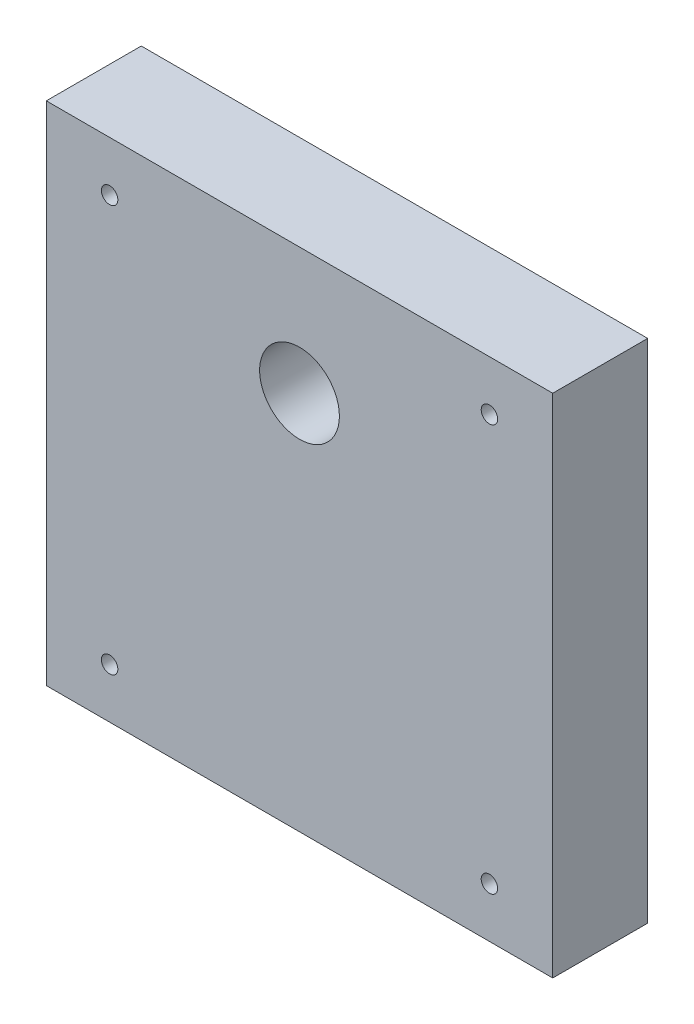
ISO-10303-21;
HEADER;
FILE_DESCRIPTION(('STEP AP214'),'2;1');
FILE_NAME('part.step','',(''),(''),'','','');
FILE_SCHEMA(('AUTOMOTIVE_DESIGN { 1 0 10303 214 1 1 1 1 }'));
ENDSEC;
DATA;
#1=APPLICATION_CONTEXT('core data for automotive mechanical design processes');
#2=APPLICATION_PROTOCOL_DEFINITION('international standard','automotive_design',2000,#1);
#3=PRODUCT_CONTEXT('',#1,'mechanical');
#4=PRODUCT('Part','Part','',(#3));
#5=PRODUCT_RELATED_PRODUCT_CATEGORY('part','',(#4));
#6=PRODUCT_DEFINITION_FORMATION('','',#4);
#7=PRODUCT_DEFINITION_CONTEXT('part definition',#1,'design');
#8=PRODUCT_DEFINITION('design','',#6,#7);
#9=PRODUCT_DEFINITION_SHAPE('','',#8);
#10=(LENGTH_UNIT() NAMED_UNIT(*) SI_UNIT(.MILLI.,.METRE.));
#11=(NAMED_UNIT(*) PLANE_ANGLE_UNIT() SI_UNIT($,.RADIAN.));
#12=(NAMED_UNIT(*) SI_UNIT($,.STERADIAN.) SOLID_ANGLE_UNIT());
#13=UNCERTAINTY_MEASURE_WITH_UNIT(LENGTH_MEASURE(1.E-05),#10,'distance_accuracy_value','');
#14=(GEOMETRIC_REPRESENTATION_CONTEXT(3) GLOBAL_UNCERTAINTY_ASSIGNED_CONTEXT((#13)) GLOBAL_UNIT_ASSIGNED_CONTEXT((#10,
#11,#12)) REPRESENTATION_CONTEXT('',''));
#15=CARTESIAN_POINT('',(0.,0.,0.));
#16=DIRECTION('',(0.,0.,1.));
#17=DIRECTION('',(1.,0.,0.));
#18=AXIS2_PLACEMENT_3D('',#15,#16,#17);
#19=CARTESIAN_POINT('',(-50.8,50.8,19.05));
#20=DIRECTION('',(1.,0.,0.));
#21=DIRECTION('',(0.,1.,0.));
#22=AXIS2_PLACEMENT_3D('',#19,#20,#21);
#23=PLANE('',#22);
#24=DIRECTION('',(0.,-1.,0.));
#25=VECTOR('',#24,1.);
#26=CARTESIAN_POINT('',(-50.8,50.8,0.));
#27=LINE('',#26,#25);
#28=CARTESIAN_POINT('',(-50.8,50.8,0.));
#29=VERTEX_POINT('',#28);
#30=CARTESIAN_POINT('',(-50.8,-50.8,0.));
#31=VERTEX_POINT('',#30);
#32=EDGE_CURVE('E113',#29,#31,#27,.T.);
#33=ORIENTED_EDGE('',*,*,#32,.T.);
#34=DIRECTION('',(0.,0.,-1.));
#35=VECTOR('',#34,1.);
#36=CARTESIAN_POINT('',(-50.8,-50.8,19.05));
#37=LINE('',#36,#35);
#38=CARTESIAN_POINT('',(-50.8,-50.8,19.05));
#39=VERTEX_POINT('',#38);
#40=EDGE_CURVE('E11',#39,#31,#37,.T.);
#41=ORIENTED_EDGE('',*,*,#40,.F.);
#42=DIRECTION('',(0.,-1.,0.));
#43=VECTOR('',#42,1.);
#44=CARTESIAN_POINT('',(-50.8,50.8,19.05));
#45=LINE('',#44,#43);
#46=CARTESIAN_POINT('',(-50.8,50.8,19.05));
#47=VERTEX_POINT('',#46);
#48=EDGE_CURVE('E95',#47,#39,#45,.T.);
#49=ORIENTED_EDGE('',*,*,#48,.F.);
#50=DIRECTION('',(0.,0.,-1.));
#51=VECTOR('',#50,1.);
#52=CARTESIAN_POINT('',(-50.8,50.8,19.05));
#53=LINE('',#52,#51);
#54=EDGE_CURVE('E62',#47,#29,#53,.T.);
#55=ORIENTED_EDGE('',*,*,#54,.T.);
#56=EDGE_LOOP('',(#33,#41,#49,#55));
#57=FACE_BOUND('',#56,.T.);
#58=ADVANCED_FACE('F45',(#57),#23,.F.);
#59=CARTESIAN_POINT('',(-50.8,-50.8,19.05));
#60=DIRECTION('',(0.,1.,0.));
#61=DIRECTION('',(0.,0.,1.));
#62=AXIS2_PLACEMENT_3D('',#59,#60,#61);
#63=PLANE('',#62);
#64=DIRECTION('',(1.,0.,0.));
#65=VECTOR('',#64,1.);
#66=CARTESIAN_POINT('',(-50.8,-50.8,0.));
#67=LINE('',#66,#65);
#68=CARTESIAN_POINT('',(50.8,-50.8,0.));
#69=VERTEX_POINT('',#68);
#70=EDGE_CURVE('E101',#31,#69,#67,.T.);
#71=ORIENTED_EDGE('',*,*,#70,.T.);
#72=DIRECTION('',(0.,0.,-1.));
#73=VECTOR('',#72,1.);
#74=CARTESIAN_POINT('',(50.8,-50.8,19.05));
#75=LINE('',#74,#73);
#76=CARTESIAN_POINT('',(50.8,-50.8,19.05));
#77=VERTEX_POINT('',#76);
#78=EDGE_CURVE('E54',#77,#69,#75,.T.);
#79=ORIENTED_EDGE('',*,*,#78,.F.);
#80=DIRECTION('',(1.,0.,0.));
#81=VECTOR('',#80,1.);
#82=CARTESIAN_POINT('',(-50.8,-50.8,19.05));
#83=LINE('',#82,#81);
#84=EDGE_CURVE('E87',#39,#77,#83,.T.);
#85=ORIENTED_EDGE('',*,*,#84,.F.);
#86=ORIENTED_EDGE('',*,*,#40,.T.);
#87=EDGE_LOOP('',(#71,#79,#85,#86));
#88=FACE_BOUND('',#87,.T.);
#89=ADVANCED_FACE('F100',(#88),#63,.F.);
#90=CARTESIAN_POINT('',(50.8,50.8,19.05));
#91=DIRECTION('',(1.,0.,0.));
#92=DIRECTION('',(0.,1.,0.));
#93=AXIS2_PLACEMENT_3D('',#90,#91,#92);
#94=PLANE('',#93);
#95=DIRECTION('',(0.,-1.,0.));
#96=VECTOR('',#95,1.);
#97=CARTESIAN_POINT('',(50.8,50.8,0.));
#98=LINE('',#97,#96);
#99=CARTESIAN_POINT('',(50.8,50.8,0.));
#100=VERTEX_POINT('',#99);
#101=EDGE_CURVE('E119',#100,#69,#98,.T.);
#102=ORIENTED_EDGE('',*,*,#101,.F.);
#103=DIRECTION('',(0.,0.,-1.));
#104=VECTOR('',#103,1.);
#105=CARTESIAN_POINT('',(50.8,50.8,19.05));
#106=LINE('',#105,#104);
#107=CARTESIAN_POINT('',(50.8,50.8,19.05));
#108=VERTEX_POINT('',#107);
#109=EDGE_CURVE('E76',#108,#100,#106,.T.);
#110=ORIENTED_EDGE('',*,*,#109,.F.);
#111=DIRECTION('',(0.,-1.,0.));
#112=VECTOR('',#111,1.);
#113=CARTESIAN_POINT('',(50.8,50.8,19.05));
#114=LINE('',#113,#112);
#115=EDGE_CURVE('E94',#108,#77,#114,.T.);
#116=ORIENTED_EDGE('',*,*,#115,.T.);
#117=ORIENTED_EDGE('',*,*,#78,.T.);
#118=EDGE_LOOP('',(#102,#110,#116,#117));
#119=FACE_BOUND('',#118,.T.);
#120=ADVANCED_FACE('F105',(#119),#94,.T.);
#121=CARTESIAN_POINT('',(-50.8,50.8,19.05));
#122=DIRECTION('',(0.,1.,0.));
#123=DIRECTION('',(0.,0.,1.));
#124=AXIS2_PLACEMENT_3D('',#121,#122,#123);
#125=PLANE('',#124);
#126=DIRECTION('',(1.,0.,0.));
#127=VECTOR('',#126,1.);
#128=CARTESIAN_POINT('',(-50.8,50.8,0.));
#129=LINE('',#128,#127);
#130=EDGE_CURVE('E122',#29,#100,#129,.T.);
#131=ORIENTED_EDGE('',*,*,#130,.F.);
#132=ORIENTED_EDGE('',*,*,#54,.F.);
#133=DIRECTION('',(1.,0.,0.));
#134=VECTOR('',#133,1.);
#135=CARTESIAN_POINT('',(-50.8,50.8,19.05));
#136=LINE('',#135,#134);
#137=EDGE_CURVE('E107',#47,#108,#136,.T.);
#138=ORIENTED_EDGE('',*,*,#137,.T.);
#139=ORIENTED_EDGE('',*,*,#109,.T.);
#140=EDGE_LOOP('',(#131,#132,#138,#139));
#141=FACE_BOUND('',#140,.T.);
#142=ADVANCED_FACE('F184',(#141),#125,.T.);
#143=CARTESIAN_POINT('',(0.,0.,19.05));
#144=DIRECTION('',(0.,0.,1.));
#145=DIRECTION('',(1.,0.,0.));
#146=AXIS2_PLACEMENT_3D('',#143,#144,#145);
#147=PLANE('',#146);
#148=CARTESIAN_POINT('',(-38.1,40.767,19.05));
#149=DIRECTION('',(0.,0.,1.));
#150=DIRECTION('',(1.,0.,0.));
#151=AXIS2_PLACEMENT_3D('',#148,#149,#150);
#152=CIRCLE('',#151,1.651);
#153=CARTESIAN_POINT('',(-36.449,40.767,19.05));
#154=VERTEX_POINT('',#153);
#155=EDGE_CURVE('E164',#154,#154,#152,.T.);
#156=ORIENTED_EDGE('',*,*,#155,.F.);
#157=EDGE_LOOP('',(#156));
#158=FACE_BOUND('',#157,.T.);
#159=CARTESIAN_POINT('',(38.1,-40.767,19.05));
#160=DIRECTION('',(0.,0.,1.));
#161=DIRECTION('',(1.,0.,0.));
#162=AXIS2_PLACEMENT_3D('',#159,#160,#161);
#163=CIRCLE('',#162,1.651);
#164=CARTESIAN_POINT('',(39.751,-40.767,19.05));
#165=VERTEX_POINT('',#164);
#166=EDGE_CURVE('E160',#165,#165,#163,.T.);
#167=ORIENTED_EDGE('',*,*,#166,.F.);
#168=EDGE_LOOP('',(#167));
#169=FACE_BOUND('',#168,.T.);
#170=CARTESIAN_POINT('',(38.1,40.767,19.05));
#171=DIRECTION('',(0.,0.,1.));
#172=DIRECTION('',(1.,0.,0.));
#173=AXIS2_PLACEMENT_3D('',#170,#171,#172);
#174=CIRCLE('',#173,1.651);
#175=CARTESIAN_POINT('',(39.751,40.767,19.05));
#176=VERTEX_POINT('',#175);
#177=EDGE_CURVE('E152',#176,#176,#174,.T.);
#178=ORIENTED_EDGE('',*,*,#177,.F.);
#179=EDGE_LOOP('',(#178));
#180=FACE_BOUND('',#179,.T.);
#181=CARTESIAN_POINT('',(-38.1,-40.767,19.05));
#182=DIRECTION('',(0.,0.,1.));
#183=DIRECTION('',(1.,0.,0.));
#184=AXIS2_PLACEMENT_3D('',#181,#182,#183);
#185=CIRCLE('',#184,1.651);
#186=CARTESIAN_POINT('',(-36.449,-40.767,19.05));
#187=VERTEX_POINT('',#186);
#188=EDGE_CURVE('E140',#187,#187,#185,.T.);
#189=ORIENTED_EDGE('',*,*,#188,.F.);
#190=EDGE_LOOP('',(#189));
#191=FACE_BOUND('',#190,.T.);
#192=CARTESIAN_POINT('',(0.,25.4,19.05));
#193=DIRECTION('',(0.,0.,1.));
#194=DIRECTION('',(1.,0.,0.));
#195=AXIS2_PLACEMENT_3D('',#192,#193,#194);
#196=CIRCLE('',#195,8.001);
#197=CARTESIAN_POINT('',(8.00099999999999,25.4,19.05));
#198=VERTEX_POINT('',#197);
#199=EDGE_CURVE('E132',#198,#198,#196,.T.);
#200=ORIENTED_EDGE('',*,*,#199,.F.);
#201=EDGE_LOOP('',(#200));
#202=FACE_BOUND('',#201,.T.);
#203=ORIENTED_EDGE('',*,*,#48,.T.);
#204=ORIENTED_EDGE('',*,*,#84,.T.);
#205=ORIENTED_EDGE('',*,*,#115,.F.);
#206=ORIENTED_EDGE('',*,*,#137,.F.);
#207=EDGE_LOOP('',(#203,#204,#205,#206));
#208=FACE_BOUND('',#207,.T.);
#209=ADVANCED_FACE('F91',(#158,#169,#180,#191,#202,#208),#147,.T.);
#210=CARTESIAN_POINT('',(0.,0.,0.));
#211=DIRECTION('',(0.,0.,1.));
#212=DIRECTION('',(1.,0.,0.));
#213=AXIS2_PLACEMENT_3D('',#210,#211,#212);
#214=PLANE('',#213);
#215=CARTESIAN_POINT('',(-38.1,40.767,0.));
#216=DIRECTION('',(0.,0.,1.));
#217=DIRECTION('',(1.,0.,0.));
#218=AXIS2_PLACEMENT_3D('',#215,#216,#217);
#219=CIRCLE('',#218,1.651);
#220=CARTESIAN_POINT('',(-36.449,40.767,0.));
#221=VERTEX_POINT('',#220);
#222=EDGE_CURVE('E144',#221,#221,#219,.T.);
#223=ORIENTED_EDGE('',*,*,#222,.T.);
#224=EDGE_LOOP('',(#223));
#225=FACE_BOUND('',#224,.T.);
#226=CARTESIAN_POINT('',(38.1,-40.767,0.));
#227=DIRECTION('',(0.,0.,1.));
#228=DIRECTION('',(1.,0.,0.));
#229=AXIS2_PLACEMENT_3D('',#226,#227,#228);
#230=CIRCLE('',#229,1.651);
#231=CARTESIAN_POINT('',(39.751,-40.767,0.));
#232=VERTEX_POINT('',#231);
#233=EDGE_CURVE('E156',#232,#232,#230,.T.);
#234=ORIENTED_EDGE('',*,*,#233,.T.);
#235=EDGE_LOOP('',(#234));
#236=FACE_BOUND('',#235,.T.);
#237=CARTESIAN_POINT('',(38.1,40.767,0.));
#238=DIRECTION('',(0.,0.,1.));
#239=DIRECTION('',(1.,0.,0.));
#240=AXIS2_PLACEMENT_3D('',#237,#238,#239);
#241=CIRCLE('',#240,1.651);
#242=CARTESIAN_POINT('',(39.751,40.767,0.));
#243=VERTEX_POINT('',#242);
#244=EDGE_CURVE('E148',#243,#243,#241,.T.);
#245=ORIENTED_EDGE('',*,*,#244,.T.);
#246=EDGE_LOOP('',(#245));
#247=FACE_BOUND('',#246,.T.);
#248=CARTESIAN_POINT('',(-38.1,-40.767,0.));
#249=DIRECTION('',(0.,0.,1.));
#250=DIRECTION('',(1.,0.,0.));
#251=AXIS2_PLACEMENT_3D('',#248,#249,#250);
#252=CIRCLE('',#251,1.651);
#253=CARTESIAN_POINT('',(-36.449,-40.767,0.));
#254=VERTEX_POINT('',#253);
#255=EDGE_CURVE('E136',#254,#254,#252,.T.);
#256=ORIENTED_EDGE('',*,*,#255,.T.);
#257=EDGE_LOOP('',(#256));
#258=FACE_BOUND('',#257,.T.);
#259=CARTESIAN_POINT('',(0.,25.4,0.));
#260=DIRECTION('',(0.,0.,1.));
#261=DIRECTION('',(1.,0.,0.));
#262=AXIS2_PLACEMENT_3D('',#259,#260,#261);
#263=CIRCLE('',#262,8.001);
#264=CARTESIAN_POINT('',(8.00099999999999,25.4,0.));
#265=VERTEX_POINT('',#264);
#266=EDGE_CURVE('E116',#265,#265,#263,.T.);
#267=ORIENTED_EDGE('',*,*,#266,.T.);
#268=EDGE_LOOP('',(#267));
#269=FACE_BOUND('',#268,.T.);
#270=ORIENTED_EDGE('',*,*,#32,.F.);
#271=ORIENTED_EDGE('',*,*,#130,.T.);
#272=ORIENTED_EDGE('',*,*,#101,.T.);
#273=ORIENTED_EDGE('',*,*,#70,.F.);
#274=EDGE_LOOP('',(#270,#271,#272,#273));
#275=FACE_BOUND('',#274,.T.);
#276=ADVANCED_FACE('F172',(#225,#236,#247,#258,#269,#275),#214,.F.);
#277=CARTESIAN_POINT('',(0.,25.4,0.));
#278=DIRECTION('',(0.,0.,1.));
#279=DIRECTION('',(1.,0.,0.));
#280=AXIS2_PLACEMENT_3D('',#277,#278,#279);
#281=CYLINDRICAL_SURFACE('',#280,8.001);
#282=CARTESIAN_POINT('',(8.00099999999999,25.4,0.));
#283=CARTESIAN_POINT('',(8.00099999999999,25.4,0.1984375));
#284=CARTESIAN_POINT('',(8.00099999999999,25.4,0.396875));
#285=CARTESIAN_POINT('',(8.00099999999999,25.4,0.79375));
#286=CARTESIAN_POINT('',(8.00099999999999,25.4,0.9921875));
#287=CARTESIAN_POINT('',(8.00099999999999,25.4,1.3890625));
#288=CARTESIAN_POINT('',(8.00099999999999,25.4,1.5875));
#289=CARTESIAN_POINT('',(8.00099999999999,25.4,1.984375));
#290=CARTESIAN_POINT('',(8.00099999999999,25.4,2.1828125));
#291=CARTESIAN_POINT('',(8.00099999999999,25.4,2.5796875));
#292=CARTESIAN_POINT('',(8.00099999999999,25.4,2.778125));
#293=CARTESIAN_POINT('',(8.00099999999999,25.4,3.175));
#294=CARTESIAN_POINT('',(8.00099999999999,25.4,3.3734375));
#295=CARTESIAN_POINT('',(8.00099999999999,25.4,3.7703125));
#296=CARTESIAN_POINT('',(8.00099999999999,25.4,3.96875));
#297=CARTESIAN_POINT('',(8.00099999999999,25.4,4.365625));
#298=CARTESIAN_POINT('',(8.00099999999999,25.4,4.5640625));
#299=CARTESIAN_POINT('',(8.00099999999999,25.4,4.9609375));
#300=CARTESIAN_POINT('',(8.00099999999999,25.4,5.159375));
#301=CARTESIAN_POINT('',(8.00099999999999,25.4,5.55625));
#302=CARTESIAN_POINT('',(8.00099999999999,25.4,5.7546875));
#303=CARTESIAN_POINT('',(8.00099999999999,25.4,6.1515625));
#304=CARTESIAN_POINT('',(8.00099999999999,25.4,6.35));
#305=CARTESIAN_POINT('',(8.00099999999999,25.4,6.746875));
#306=CARTESIAN_POINT('',(8.00099999999999,25.4,6.9453125));
#307=CARTESIAN_POINT('',(8.00099999999999,25.4,7.3421875));
#308=CARTESIAN_POINT('',(8.00099999999999,25.4,7.540625));
#309=CARTESIAN_POINT('',(8.00099999999999,25.4,7.9375));
#310=CARTESIAN_POINT('',(8.00099999999999,25.4,8.1359375));
#311=CARTESIAN_POINT('',(8.00099999999999,25.4,8.5328125));
#312=CARTESIAN_POINT('',(8.00099999999999,25.4,8.73125));
#313=CARTESIAN_POINT('',(8.00099999999999,25.4,9.128125));
#314=CARTESIAN_POINT('',(8.00099999999999,25.4,9.3265625));
#315=CARTESIAN_POINT('',(8.00099999999999,25.4,9.7234375));
#316=CARTESIAN_POINT('',(8.00099999999999,25.4,9.921875));
#317=CARTESIAN_POINT('',(8.00099999999999,25.4,10.31875));
#318=CARTESIAN_POINT('',(8.00099999999999,25.4,10.5171875));
#319=CARTESIAN_POINT('',(8.00099999999999,25.4,10.9140625));
#320=CARTESIAN_POINT('',(8.00099999999999,25.4,11.1125));
#321=CARTESIAN_POINT('',(8.00099999999999,25.4,11.509375));
#322=CARTESIAN_POINT('',(8.00099999999999,25.4,11.7078125));
#323=CARTESIAN_POINT('',(8.00099999999999,25.4,12.1046875));
#324=CARTESIAN_POINT('',(8.00099999999999,25.4,12.303125));
#325=CARTESIAN_POINT('',(8.00099999999999,25.4,12.7));
#326=CARTESIAN_POINT('',(8.00099999999999,25.4,12.8984375));
#327=CARTESIAN_POINT('',(8.00099999999999,25.4,13.2953125));
#328=CARTESIAN_POINT('',(8.00099999999999,25.4,13.49375));
#329=CARTESIAN_POINT('',(8.00099999999999,25.4,13.890625));
#330=CARTESIAN_POINT('',(8.00099999999999,25.4,14.0890625));
#331=CARTESIAN_POINT('',(8.00099999999999,25.4,14.4859375));
#332=CARTESIAN_POINT('',(8.00099999999999,25.4,14.684375));
#333=CARTESIAN_POINT('',(8.00099999999999,25.4,15.08125));
#334=CARTESIAN_POINT('',(8.00099999999999,25.4,15.2796875));
#335=CARTESIAN_POINT('',(8.00099999999999,25.4,15.6765625));
#336=CARTESIAN_POINT('',(8.00099999999999,25.4,15.875));
#337=CARTESIAN_POINT('',(8.00099999999999,25.4,16.271875));
#338=CARTESIAN_POINT('',(8.00099999999999,25.4,16.4703125));
#339=CARTESIAN_POINT('',(8.00099999999999,25.4,16.8671875));
#340=CARTESIAN_POINT('',(8.00099999999999,25.4,17.065625));
#341=CARTESIAN_POINT('',(8.00099999999999,25.4,17.4625));
#342=CARTESIAN_POINT('',(8.00099999999999,25.4,17.6609375));
#343=CARTESIAN_POINT('',(8.00099999999999,25.4,18.0578125));
#344=CARTESIAN_POINT('',(8.00099999999999,25.4,18.25625));
#345=CARTESIAN_POINT('',(8.00099999999999,25.4,18.653125));
#346=CARTESIAN_POINT('',(8.00099999999999,25.4,18.8515625));
#347=CARTESIAN_POINT('',(8.00099999999999,25.4,19.05));
#348=B_SPLINE_CURVE_WITH_KNOTS('',3,(#282,#283,#284,#285,#286,#287,#288,#289,#290,#291,#292,
#293,#294,#295,#296,#297,#298,#299,#300,#301,#302,#303,#304,#305,#306,#307,#308,#309,#310,#311,
#312,#313,#314,#315,#316,#317,#318,#319,#320,#321,#322,#323,#324,#325,#326,#327,#328,#329,#330,
#331,#332,#333,#334,#335,#336,#337,#338,#339,#340,#341,#342,#343,#344,#345,#346,#347),
.UNSPECIFIED.,.F.,.F.,(4,2,2,2,2,2,2,2,2,2,2,2,2,2,2,2,2,2,2,2,2,2,2,2,2,2,2,2,2,2,2,2,4),(0.,
0.5953125,1.190625,1.7859375,2.38125,2.9765625,3.571875,4.1671875,4.7625,5.3578125,5.953125,
6.5484375,7.14375,7.7390625,8.334375,8.9296875,9.525,10.1203125,10.715625,11.3109375,11.90625,
12.5015625,13.096875,13.6921875,14.2875,14.8828125,15.478125,16.0734375,16.66875,17.2640625,
17.859375,18.4546875,19.05),.UNSPECIFIED.);
#349=EDGE_CURVE('BSEAM194',#265,#198,#348,.T.);
#350=ORIENTED_EDGE('',*,*,#266,.F.);
#351=ORIENTED_EDGE('',*,*,#199,.T.);
#352=ORIENTED_EDGE('',*,*,#349,.T.);
#353=ORIENTED_EDGE('',*,*,#349,.F.);
#354=EDGE_LOOP('',(#350,#352,#351,#353));
#355=FACE_BOUND('',#354,.T.);
#356=ADVANCED_FACE('F194',(#355),#281,.F.);
#357=CARTESIAN_POINT('',(-38.1,-40.767,0.));
#358=DIRECTION('',(0.,0.,1.));
#359=DIRECTION('',(1.,0.,0.));
#360=AXIS2_PLACEMENT_3D('',#357,#358,#359);
#361=CYLINDRICAL_SURFACE('',#360,1.651);
#362=CARTESIAN_POINT('',(-36.449,-40.767,0.));
#363=CARTESIAN_POINT('',(-36.449,-40.767,0.1984375));
#364=CARTESIAN_POINT('',(-36.449,-40.767,0.396875));
#365=CARTESIAN_POINT('',(-36.449,-40.767,0.79375));
#366=CARTESIAN_POINT('',(-36.449,-40.767,0.9921875));
#367=CARTESIAN_POINT('',(-36.449,-40.767,1.3890625));
#368=CARTESIAN_POINT('',(-36.449,-40.767,1.5875));
#369=CARTESIAN_POINT('',(-36.449,-40.767,1.984375));
#370=CARTESIAN_POINT('',(-36.449,-40.767,2.1828125));
#371=CARTESIAN_POINT('',(-36.449,-40.767,2.5796875));
#372=CARTESIAN_POINT('',(-36.449,-40.767,2.778125));
#373=CARTESIAN_POINT('',(-36.449,-40.767,3.175));
#374=CARTESIAN_POINT('',(-36.449,-40.767,3.3734375));
#375=CARTESIAN_POINT('',(-36.449,-40.767,3.7703125));
#376=CARTESIAN_POINT('',(-36.449,-40.767,3.96875));
#377=CARTESIAN_POINT('',(-36.449,-40.767,4.365625));
#378=CARTESIAN_POINT('',(-36.449,-40.767,4.5640625));
#379=CARTESIAN_POINT('',(-36.449,-40.767,4.9609375));
#380=CARTESIAN_POINT('',(-36.449,-40.767,5.159375));
#381=CARTESIAN_POINT('',(-36.449,-40.767,5.55625));
#382=CARTESIAN_POINT('',(-36.449,-40.767,5.7546875));
#383=CARTESIAN_POINT('',(-36.449,-40.767,6.1515625));
#384=CARTESIAN_POINT('',(-36.449,-40.767,6.35));
#385=CARTESIAN_POINT('',(-36.449,-40.767,6.746875));
#386=CARTESIAN_POINT('',(-36.449,-40.767,6.9453125));
#387=CARTESIAN_POINT('',(-36.449,-40.767,7.3421875));
#388=CARTESIAN_POINT('',(-36.449,-40.767,7.540625));
#389=CARTESIAN_POINT('',(-36.449,-40.767,7.9375));
#390=CARTESIAN_POINT('',(-36.449,-40.767,8.1359375));
#391=CARTESIAN_POINT('',(-36.449,-40.767,8.5328125));
#392=CARTESIAN_POINT('',(-36.449,-40.767,8.73125));
#393=CARTESIAN_POINT('',(-36.449,-40.767,9.128125));
#394=CARTESIAN_POINT('',(-36.449,-40.767,9.3265625));
#395=CARTESIAN_POINT('',(-36.449,-40.767,9.7234375));
#396=CARTESIAN_POINT('',(-36.449,-40.767,9.921875));
#397=CARTESIAN_POINT('',(-36.449,-40.767,10.31875));
#398=CARTESIAN_POINT('',(-36.449,-40.767,10.5171875));
#399=CARTESIAN_POINT('',(-36.449,-40.767,10.9140625));
#400=CARTESIAN_POINT('',(-36.449,-40.767,11.1125));
#401=CARTESIAN_POINT('',(-36.449,-40.767,11.509375));
#402=CARTESIAN_POINT('',(-36.449,-40.767,11.7078125));
#403=CARTESIAN_POINT('',(-36.449,-40.767,12.1046875));
#404=CARTESIAN_POINT('',(-36.449,-40.767,12.303125));
#405=CARTESIAN_POINT('',(-36.449,-40.767,12.7));
#406=CARTESIAN_POINT('',(-36.449,-40.767,12.8984375));
#407=CARTESIAN_POINT('',(-36.449,-40.767,13.2953125));
#408=CARTESIAN_POINT('',(-36.449,-40.767,13.49375));
#409=CARTESIAN_POINT('',(-36.449,-40.767,13.890625));
#410=CARTESIAN_POINT('',(-36.449,-40.767,14.0890625));
#411=CARTESIAN_POINT('',(-36.449,-40.767,14.4859375));
#412=CARTESIAN_POINT('',(-36.449,-40.767,14.684375));
#413=CARTESIAN_POINT('',(-36.449,-40.767,15.08125));
#414=CARTESIAN_POINT('',(-36.449,-40.767,15.2796875));
#415=CARTESIAN_POINT('',(-36.449,-40.767,15.6765625));
#416=CARTESIAN_POINT('',(-36.449,-40.767,15.875));
#417=CARTESIAN_POINT('',(-36.449,-40.767,16.271875));
#418=CARTESIAN_POINT('',(-36.449,-40.767,16.4703125));
#419=CARTESIAN_POINT('',(-36.449,-40.767,16.8671875));
#420=CARTESIAN_POINT('',(-36.449,-40.767,17.065625));
#421=CARTESIAN_POINT('',(-36.449,-40.767,17.4625));
#422=CARTESIAN_POINT('',(-36.449,-40.767,17.6609375));
#423=CARTESIAN_POINT('',(-36.449,-40.767,18.0578125));
#424=CARTESIAN_POINT('',(-36.449,-40.767,18.25625));
#425=CARTESIAN_POINT('',(-36.449,-40.767,18.653125));
#426=CARTESIAN_POINT('',(-36.449,-40.767,18.8515625));
#427=CARTESIAN_POINT('',(-36.449,-40.767,19.05));
#428=B_SPLINE_CURVE_WITH_KNOTS('',3,(#362,#363,#364,#365,#366,#367,#368,#369,#370,#371,#372,
#373,#374,#375,#376,#377,#378,#379,#380,#381,#382,#383,#384,#385,#386,#387,#388,#389,#390,#391,
#392,#393,#394,#395,#396,#397,#398,#399,#400,#401,#402,#403,#404,#405,#406,#407,#408,#409,#410,
#411,#412,#413,#414,#415,#416,#417,#418,#419,#420,#421,#422,#423,#424,#425,#426,#427),
.UNSPECIFIED.,.F.,.F.,(4,2,2,2,2,2,2,2,2,2,2,2,2,2,2,2,2,2,2,2,2,2,2,2,2,2,2,2,2,2,2,2,4),(0.,
0.5953125,1.190625,1.7859375,2.38125,2.9765625,3.571875,4.1671875,4.7625,5.3578125,5.953125,
6.5484375,7.14375,7.7390625,8.334375,8.9296875,9.525,10.1203125,10.715625,11.3109375,11.90625,
12.5015625,13.096875,13.6921875,14.2875,14.8828125,15.478125,16.0734375,16.66875,17.2640625,
17.859375,18.4546875,19.05),.UNSPECIFIED.);
#429=EDGE_CURVE('BSEAM196',#254,#187,#428,.T.);
#430=ORIENTED_EDGE('',*,*,#255,.F.);
#431=ORIENTED_EDGE('',*,*,#188,.T.);
#432=ORIENTED_EDGE('',*,*,#429,.T.);
#433=ORIENTED_EDGE('',*,*,#429,.F.);
#434=EDGE_LOOP('',(#430,#432,#431,#433));
#435=FACE_BOUND('',#434,.T.);
#436=ADVANCED_FACE('F196',(#435),#361,.F.);
#437=CARTESIAN_POINT('',(38.1,40.767,0.));
#438=DIRECTION('',(0.,0.,1.));
#439=DIRECTION('',(1.,0.,0.));
#440=AXIS2_PLACEMENT_3D('',#437,#438,#439);
#441=CYLINDRICAL_SURFACE('',#440,1.651);
#442=CARTESIAN_POINT('',(39.751,40.767,0.));
#443=CARTESIAN_POINT('',(39.751,40.767,0.1984375));
#444=CARTESIAN_POINT('',(39.751,40.767,0.396875));
#445=CARTESIAN_POINT('',(39.751,40.767,0.79375));
#446=CARTESIAN_POINT('',(39.751,40.767,0.9921875));
#447=CARTESIAN_POINT('',(39.751,40.767,1.3890625));
#448=CARTESIAN_POINT('',(39.751,40.767,1.5875));
#449=CARTESIAN_POINT('',(39.751,40.767,1.984375));
#450=CARTESIAN_POINT('',(39.751,40.767,2.1828125));
#451=CARTESIAN_POINT('',(39.751,40.767,2.5796875));
#452=CARTESIAN_POINT('',(39.751,40.767,2.778125));
#453=CARTESIAN_POINT('',(39.751,40.767,3.175));
#454=CARTESIAN_POINT('',(39.751,40.767,3.3734375));
#455=CARTESIAN_POINT('',(39.751,40.767,3.7703125));
#456=CARTESIAN_POINT('',(39.751,40.767,3.96875));
#457=CARTESIAN_POINT('',(39.751,40.767,4.365625));
#458=CARTESIAN_POINT('',(39.751,40.767,4.5640625));
#459=CARTESIAN_POINT('',(39.751,40.767,4.9609375));
#460=CARTESIAN_POINT('',(39.751,40.767,5.159375));
#461=CARTESIAN_POINT('',(39.751,40.767,5.55625));
#462=CARTESIAN_POINT('',(39.751,40.767,5.7546875));
#463=CARTESIAN_POINT('',(39.751,40.767,6.1515625));
#464=CARTESIAN_POINT('',(39.751,40.767,6.35));
#465=CARTESIAN_POINT('',(39.751,40.767,6.746875));
#466=CARTESIAN_POINT('',(39.751,40.767,6.9453125));
#467=CARTESIAN_POINT('',(39.751,40.767,7.3421875));
#468=CARTESIAN_POINT('',(39.751,40.767,7.540625));
#469=CARTESIAN_POINT('',(39.751,40.767,7.9375));
#470=CARTESIAN_POINT('',(39.751,40.767,8.1359375));
#471=CARTESIAN_POINT('',(39.751,40.767,8.5328125));
#472=CARTESIAN_POINT('',(39.751,40.767,8.73125));
#473=CARTESIAN_POINT('',(39.751,40.767,9.128125));
#474=CARTESIAN_POINT('',(39.751,40.767,9.3265625));
#475=CARTESIAN_POINT('',(39.751,40.767,9.7234375));
#476=CARTESIAN_POINT('',(39.751,40.767,9.921875));
#477=CARTESIAN_POINT('',(39.751,40.767,10.31875));
#478=CARTESIAN_POINT('',(39.751,40.767,10.5171875));
#479=CARTESIAN_POINT('',(39.751,40.767,10.9140625));
#480=CARTESIAN_POINT('',(39.751,40.767,11.1125));
#481=CARTESIAN_POINT('',(39.751,40.767,11.509375));
#482=CARTESIAN_POINT('',(39.751,40.767,11.7078125));
#483=CARTESIAN_POINT('',(39.751,40.767,12.1046875));
#484=CARTESIAN_POINT('',(39.751,40.767,12.303125));
#485=CARTESIAN_POINT('',(39.751,40.767,12.7));
#486=CARTESIAN_POINT('',(39.751,40.767,12.8984375));
#487=CARTESIAN_POINT('',(39.751,40.767,13.2953125));
#488=CARTESIAN_POINT('',(39.751,40.767,13.49375));
#489=CARTESIAN_POINT('',(39.751,40.767,13.890625));
#490=CARTESIAN_POINT('',(39.751,40.767,14.0890625));
#491=CARTESIAN_POINT('',(39.751,40.767,14.4859375));
#492=CARTESIAN_POINT('',(39.751,40.767,14.684375));
#493=CARTESIAN_POINT('',(39.751,40.767,15.08125));
#494=CARTESIAN_POINT('',(39.751,40.767,15.2796875));
#495=CARTESIAN_POINT('',(39.751,40.767,15.6765625));
#496=CARTESIAN_POINT('',(39.751,40.767,15.875));
#497=CARTESIAN_POINT('',(39.751,40.767,16.271875));
#498=CARTESIAN_POINT('',(39.751,40.767,16.4703125));
#499=CARTESIAN_POINT('',(39.751,40.767,16.8671875));
#500=CARTESIAN_POINT('',(39.751,40.767,17.065625));
#501=CARTESIAN_POINT('',(39.751,40.767,17.4625));
#502=CARTESIAN_POINT('',(39.751,40.767,17.6609375));
#503=CARTESIAN_POINT('',(39.751,40.767,18.0578125));
#504=CARTESIAN_POINT('',(39.751,40.767,18.25625));
#505=CARTESIAN_POINT('',(39.751,40.767,18.653125));
#506=CARTESIAN_POINT('',(39.751,40.767,18.8515625));
#507=CARTESIAN_POINT('',(39.751,40.767,19.05));
#508=B_SPLINE_CURVE_WITH_KNOTS('',3,(#442,#443,#444,#445,#446,#447,#448,#449,#450,#451,#452,
#453,#454,#455,#456,#457,#458,#459,#460,#461,#462,#463,#464,#465,#466,#467,#468,#469,#470,#471,
#472,#473,#474,#475,#476,#477,#478,#479,#480,#481,#482,#483,#484,#485,#486,#487,#488,#489,#490,
#491,#492,#493,#494,#495,#496,#497,#498,#499,#500,#501,#502,#503,#504,#505,#506,#507),
.UNSPECIFIED.,.F.,.F.,(4,2,2,2,2,2,2,2,2,2,2,2,2,2,2,2,2,2,2,2,2,2,2,2,2,2,2,2,2,2,2,2,4),(0.,
0.5953125,1.190625,1.7859375,2.38125,2.9765625,3.571875,4.1671875,4.7625,5.3578125,5.953125,
6.5484375,7.14375,7.7390625,8.334375,8.9296875,9.525,10.1203125,10.715625,11.3109375,11.90625,
12.5015625,13.096875,13.6921875,14.2875,14.8828125,15.478125,16.0734375,16.66875,17.2640625,
17.859375,18.4546875,19.05),.UNSPECIFIED.);
#509=EDGE_CURVE('BSEAM203',#243,#176,#508,.T.);
#510=ORIENTED_EDGE('',*,*,#244,.F.);
#511=ORIENTED_EDGE('',*,*,#177,.T.);
#512=ORIENTED_EDGE('',*,*,#509,.T.);
#513=ORIENTED_EDGE('',*,*,#509,.F.);
#514=EDGE_LOOP('',(#510,#512,#511,#513));
#515=FACE_BOUND('',#514,.T.);
#516=ADVANCED_FACE('F203',(#515),#441,.F.);
#517=CARTESIAN_POINT('',(38.1,-40.767,0.));
#518=DIRECTION('',(0.,0.,1.));
#519=DIRECTION('',(1.,0.,0.));
#520=AXIS2_PLACEMENT_3D('',#517,#518,#519);
#521=CYLINDRICAL_SURFACE('',#520,1.651);
#522=CARTESIAN_POINT('',(39.751,-40.767,0.));
#523=CARTESIAN_POINT('',(39.751,-40.767,0.1984375));
#524=CARTESIAN_POINT('',(39.751,-40.767,0.396875));
#525=CARTESIAN_POINT('',(39.751,-40.767,0.79375));
#526=CARTESIAN_POINT('',(39.751,-40.767,0.9921875));
#527=CARTESIAN_POINT('',(39.751,-40.767,1.3890625));
#528=CARTESIAN_POINT('',(39.751,-40.767,1.5875));
#529=CARTESIAN_POINT('',(39.751,-40.767,1.984375));
#530=CARTESIAN_POINT('',(39.751,-40.767,2.1828125));
#531=CARTESIAN_POINT('',(39.751,-40.767,2.5796875));
#532=CARTESIAN_POINT('',(39.751,-40.767,2.778125));
#533=CARTESIAN_POINT('',(39.751,-40.767,3.175));
#534=CARTESIAN_POINT('',(39.751,-40.767,3.3734375));
#535=CARTESIAN_POINT('',(39.751,-40.767,3.7703125));
#536=CARTESIAN_POINT('',(39.751,-40.767,3.96875));
#537=CARTESIAN_POINT('',(39.751,-40.767,4.365625));
#538=CARTESIAN_POINT('',(39.751,-40.767,4.5640625));
#539=CARTESIAN_POINT('',(39.751,-40.767,4.9609375));
#540=CARTESIAN_POINT('',(39.751,-40.767,5.159375));
#541=CARTESIAN_POINT('',(39.751,-40.767,5.55625));
#542=CARTESIAN_POINT('',(39.751,-40.767,5.7546875));
#543=CARTESIAN_POINT('',(39.751,-40.767,6.1515625));
#544=CARTESIAN_POINT('',(39.751,-40.767,6.35));
#545=CARTESIAN_POINT('',(39.751,-40.767,6.746875));
#546=CARTESIAN_POINT('',(39.751,-40.767,6.9453125));
#547=CARTESIAN_POINT('',(39.751,-40.767,7.3421875));
#548=CARTESIAN_POINT('',(39.751,-40.767,7.540625));
#549=CARTESIAN_POINT('',(39.751,-40.767,7.9375));
#550=CARTESIAN_POINT('',(39.751,-40.767,8.1359375));
#551=CARTESIAN_POINT('',(39.751,-40.767,8.5328125));
#552=CARTESIAN_POINT('',(39.751,-40.767,8.73125));
#553=CARTESIAN_POINT('',(39.751,-40.767,9.128125));
#554=CARTESIAN_POINT('',(39.751,-40.767,9.3265625));
#555=CARTESIAN_POINT('',(39.751,-40.767,9.7234375));
#556=CARTESIAN_POINT('',(39.751,-40.767,9.921875));
#557=CARTESIAN_POINT('',(39.751,-40.767,10.31875));
#558=CARTESIAN_POINT('',(39.751,-40.767,10.5171875));
#559=CARTESIAN_POINT('',(39.751,-40.767,10.9140625));
#560=CARTESIAN_POINT('',(39.751,-40.767,11.1125));
#561=CARTESIAN_POINT('',(39.751,-40.767,11.509375));
#562=CARTESIAN_POINT('',(39.751,-40.767,11.7078125));
#563=CARTESIAN_POINT('',(39.751,-40.767,12.1046875));
#564=CARTESIAN_POINT('',(39.751,-40.767,12.303125));
#565=CARTESIAN_POINT('',(39.751,-40.767,12.7));
#566=CARTESIAN_POINT('',(39.751,-40.767,12.8984375));
#567=CARTESIAN_POINT('',(39.751,-40.767,13.2953125));
#568=CARTESIAN_POINT('',(39.751,-40.767,13.49375));
#569=CARTESIAN_POINT('',(39.751,-40.767,13.890625));
#570=CARTESIAN_POINT('',(39.751,-40.767,14.0890625));
#571=CARTESIAN_POINT('',(39.751,-40.767,14.4859375));
#572=CARTESIAN_POINT('',(39.751,-40.767,14.684375));
#573=CARTESIAN_POINT('',(39.751,-40.767,15.08125));
#574=CARTESIAN_POINT('',(39.751,-40.767,15.2796875));
#575=CARTESIAN_POINT('',(39.751,-40.767,15.6765625));
#576=CARTESIAN_POINT('',(39.751,-40.767,15.875));
#577=CARTESIAN_POINT('',(39.751,-40.767,16.271875));
#578=CARTESIAN_POINT('',(39.751,-40.767,16.4703125));
#579=CARTESIAN_POINT('',(39.751,-40.767,16.8671875));
#580=CARTESIAN_POINT('',(39.751,-40.767,17.065625));
#581=CARTESIAN_POINT('',(39.751,-40.767,17.4625));
#582=CARTESIAN_POINT('',(39.751,-40.767,17.6609375));
#583=CARTESIAN_POINT('',(39.751,-40.767,18.0578125));
#584=CARTESIAN_POINT('',(39.751,-40.767,18.25625));
#585=CARTESIAN_POINT('',(39.751,-40.767,18.653125));
#586=CARTESIAN_POINT('',(39.751,-40.767,18.8515625));
#587=CARTESIAN_POINT('',(39.751,-40.767,19.05));
#588=B_SPLINE_CURVE_WITH_KNOTS('',3,(#522,#523,#524,#525,#526,#527,#528,#529,#530,#531,#532,
#533,#534,#535,#536,#537,#538,#539,#540,#541,#542,#543,#544,#545,#546,#547,#548,#549,#550,#551,
#552,#553,#554,#555,#556,#557,#558,#559,#560,#561,#562,#563,#564,#565,#566,#567,#568,#569,#570,
#571,#572,#573,#574,#575,#576,#577,#578,#579,#580,#581,#582,#583,#584,#585,#586,#587),
.UNSPECIFIED.,.F.,.F.,(4,2,2,2,2,2,2,2,2,2,2,2,2,2,2,2,2,2,2,2,2,2,2,2,2,2,2,2,2,2,2,2,4),(0.,
0.5953125,1.190625,1.7859375,2.38125,2.9765625,3.571875,4.1671875,4.7625,5.3578125,5.953125,
6.5484375,7.14375,7.7390625,8.334375,8.9296875,9.525,10.1203125,10.715625,11.3109375,11.90625,
12.5015625,13.096875,13.6921875,14.2875,14.8828125,15.478125,16.0734375,16.66875,17.2640625,
17.859375,18.4546875,19.05),.UNSPECIFIED.);
#589=EDGE_CURVE('BSEAM178',#232,#165,#588,.T.);
#590=ORIENTED_EDGE('',*,*,#233,.F.);
#591=ORIENTED_EDGE('',*,*,#166,.T.);
#592=ORIENTED_EDGE('',*,*,#589,.T.);
#593=ORIENTED_EDGE('',*,*,#589,.F.);
#594=EDGE_LOOP('',(#590,#592,#591,#593));
#595=FACE_BOUND('',#594,.T.);
#596=ADVANCED_FACE('F178',(#595),#521,.F.);
#597=CARTESIAN_POINT('',(-38.1,40.767,0.));
#598=DIRECTION('',(0.,0.,1.));
#599=DIRECTION('',(1.,0.,0.));
#600=AXIS2_PLACEMENT_3D('',#597,#598,#599);
#601=CYLINDRICAL_SURFACE('',#600,1.651);
#602=CARTESIAN_POINT('',(-36.449,40.767,0.));
#603=CARTESIAN_POINT('',(-36.449,40.767,0.1984375));
#604=CARTESIAN_POINT('',(-36.449,40.767,0.396875));
#605=CARTESIAN_POINT('',(-36.449,40.767,0.79375));
#606=CARTESIAN_POINT('',(-36.449,40.767,0.9921875));
#607=CARTESIAN_POINT('',(-36.449,40.767,1.3890625));
#608=CARTESIAN_POINT('',(-36.449,40.767,1.5875));
#609=CARTESIAN_POINT('',(-36.449,40.767,1.984375));
#610=CARTESIAN_POINT('',(-36.449,40.767,2.1828125));
#611=CARTESIAN_POINT('',(-36.449,40.767,2.5796875));
#612=CARTESIAN_POINT('',(-36.449,40.767,2.778125));
#613=CARTESIAN_POINT('',(-36.449,40.767,3.175));
#614=CARTESIAN_POINT('',(-36.449,40.767,3.3734375));
#615=CARTESIAN_POINT('',(-36.449,40.767,3.7703125));
#616=CARTESIAN_POINT('',(-36.449,40.767,3.96875));
#617=CARTESIAN_POINT('',(-36.449,40.767,4.365625));
#618=CARTESIAN_POINT('',(-36.449,40.767,4.5640625));
#619=CARTESIAN_POINT('',(-36.449,40.767,4.9609375));
#620=CARTESIAN_POINT('',(-36.449,40.767,5.159375));
#621=CARTESIAN_POINT('',(-36.449,40.767,5.55625));
#622=CARTESIAN_POINT('',(-36.449,40.767,5.7546875));
#623=CARTESIAN_POINT('',(-36.449,40.767,6.1515625));
#624=CARTESIAN_POINT('',(-36.449,40.767,6.35));
#625=CARTESIAN_POINT('',(-36.449,40.767,6.746875));
#626=CARTESIAN_POINT('',(-36.449,40.767,6.9453125));
#627=CARTESIAN_POINT('',(-36.449,40.767,7.3421875));
#628=CARTESIAN_POINT('',(-36.449,40.767,7.540625));
#629=CARTESIAN_POINT('',(-36.449,40.767,7.9375));
#630=CARTESIAN_POINT('',(-36.449,40.767,8.1359375));
#631=CARTESIAN_POINT('',(-36.449,40.767,8.5328125));
#632=CARTESIAN_POINT('',(-36.449,40.767,8.73125));
#633=CARTESIAN_POINT('',(-36.449,40.767,9.128125));
#634=CARTESIAN_POINT('',(-36.449,40.767,9.3265625));
#635=CARTESIAN_POINT('',(-36.449,40.767,9.7234375));
#636=CARTESIAN_POINT('',(-36.449,40.767,9.921875));
#637=CARTESIAN_POINT('',(-36.449,40.767,10.31875));
#638=CARTESIAN_POINT('',(-36.449,40.767,10.5171875));
#639=CARTESIAN_POINT('',(-36.449,40.767,10.9140625));
#640=CARTESIAN_POINT('',(-36.449,40.767,11.1125));
#641=CARTESIAN_POINT('',(-36.449,40.767,11.509375));
#642=CARTESIAN_POINT('',(-36.449,40.767,11.7078125));
#643=CARTESIAN_POINT('',(-36.449,40.767,12.1046875));
#644=CARTESIAN_POINT('',(-36.449,40.767,12.303125));
#645=CARTESIAN_POINT('',(-36.449,40.767,12.7));
#646=CARTESIAN_POINT('',(-36.449,40.767,12.8984375));
#647=CARTESIAN_POINT('',(-36.449,40.767,13.2953125));
#648=CARTESIAN_POINT('',(-36.449,40.767,13.49375));
#649=CARTESIAN_POINT('',(-36.449,40.767,13.890625));
#650=CARTESIAN_POINT('',(-36.449,40.767,14.0890625));
#651=CARTESIAN_POINT('',(-36.449,40.767,14.4859375));
#652=CARTESIAN_POINT('',(-36.449,40.767,14.684375));
#653=CARTESIAN_POINT('',(-36.449,40.767,15.08125));
#654=CARTESIAN_POINT('',(-36.449,40.767,15.2796875));
#655=CARTESIAN_POINT('',(-36.449,40.767,15.6765625));
#656=CARTESIAN_POINT('',(-36.449,40.767,15.875));
#657=CARTESIAN_POINT('',(-36.449,40.767,16.271875));
#658=CARTESIAN_POINT('',(-36.449,40.767,16.4703125));
#659=CARTESIAN_POINT('',(-36.449,40.767,16.8671875));
#660=CARTESIAN_POINT('',(-36.449,40.767,17.065625));
#661=CARTESIAN_POINT('',(-36.449,40.767,17.4625));
#662=CARTESIAN_POINT('',(-36.449,40.767,17.6609375));
#663=CARTESIAN_POINT('',(-36.449,40.767,18.0578125));
#664=CARTESIAN_POINT('',(-36.449,40.767,18.25625));
#665=CARTESIAN_POINT('',(-36.449,40.767,18.653125));
#666=CARTESIAN_POINT('',(-36.449,40.767,18.8515625));
#667=CARTESIAN_POINT('',(-36.449,40.767,19.05));
#668=B_SPLINE_CURVE_WITH_KNOTS('',3,(#602,#603,#604,#605,#606,#607,#608,#609,#610,#611,#612,
#613,#614,#615,#616,#617,#618,#619,#620,#621,#622,#623,#624,#625,#626,#627,#628,#629,#630,#631,
#632,#633,#634,#635,#636,#637,#638,#639,#640,#641,#642,#643,#644,#645,#646,#647,#648,#649,#650,
#651,#652,#653,#654,#655,#656,#657,#658,#659,#660,#661,#662,#663,#664,#665,#666,#667),
.UNSPECIFIED.,.F.,.F.,(4,2,2,2,2,2,2,2,2,2,2,2,2,2,2,2,2,2,2,2,2,2,2,2,2,2,2,2,2,2,2,2,4),(0.,
0.5953125,1.190625,1.7859375,2.38125,2.9765625,3.571875,4.1671875,4.7625,5.3578125,5.953125,
6.5484375,7.14375,7.7390625,8.334375,8.9296875,9.525,10.1203125,10.715625,11.3109375,11.90625,
12.5015625,13.096875,13.6921875,14.2875,14.8828125,15.478125,16.0734375,16.66875,17.2640625,
17.859375,18.4546875,19.05),.UNSPECIFIED.);
#669=EDGE_CURVE('BSEAM175',#221,#154,#668,.T.);
#670=ORIENTED_EDGE('',*,*,#222,.F.);
#671=ORIENTED_EDGE('',*,*,#155,.T.);
#672=ORIENTED_EDGE('',*,*,#669,.T.);
#673=ORIENTED_EDGE('',*,*,#669,.F.);
#674=EDGE_LOOP('',(#670,#672,#671,#673));
#675=FACE_BOUND('',#674,.T.);
#676=ADVANCED_FACE('F175',(#675),#601,.F.);
#677=CLOSED_SHELL('',(#58,#89,#120,#142,#209,#276,#356,#436,#516,#596,#676));
#678=MANIFOLD_SOLID_BREP('B2',#677);
#679=ADVANCED_BREP_SHAPE_REPRESENTATION('',(#18,#678),#14);
#680=SHAPE_DEFINITION_REPRESENTATION(#9,#679);
ENDSEC;
END-ISO-10303-21;
